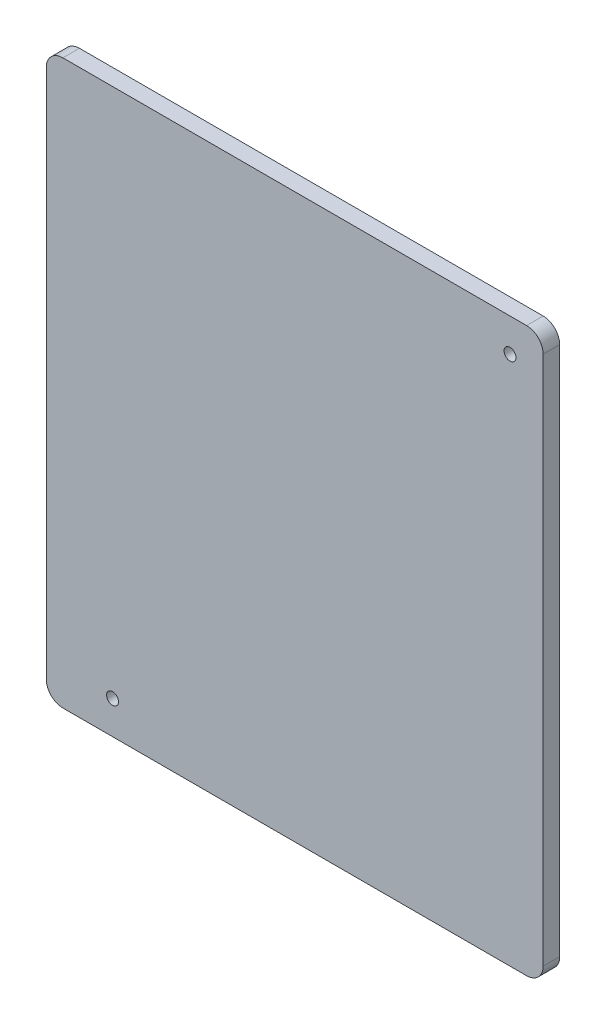
ISO-10303-21;
HEADER;
FILE_DESCRIPTION(('STEP AP214'),'2;1');
FILE_NAME('part.step','',(''),(''),'','','');
FILE_SCHEMA(('AUTOMOTIVE_DESIGN { 1 0 10303 214 1 1 1 1 }'));
ENDSEC;
DATA;
#1=APPLICATION_CONTEXT('core data for automotive mechanical design processes');
#2=APPLICATION_PROTOCOL_DEFINITION('international standard','automotive_design',2000,#1);
#3=PRODUCT_CONTEXT('',#1,'mechanical');
#4=PRODUCT('Part','Part','',(#3));
#5=PRODUCT_RELATED_PRODUCT_CATEGORY('part','',(#4));
#6=PRODUCT_DEFINITION_FORMATION('','',#4);
#7=PRODUCT_DEFINITION_CONTEXT('part definition',#1,'design');
#8=PRODUCT_DEFINITION('design','',#6,#7);
#9=PRODUCT_DEFINITION_SHAPE('','',#8);
#10=(LENGTH_UNIT() NAMED_UNIT(*) SI_UNIT(.MILLI.,.METRE.));
#11=(NAMED_UNIT(*) PLANE_ANGLE_UNIT() SI_UNIT($,.RADIAN.));
#12=(NAMED_UNIT(*) SI_UNIT($,.STERADIAN.) SOLID_ANGLE_UNIT());
#13=UNCERTAINTY_MEASURE_WITH_UNIT(LENGTH_MEASURE(1.E-05),#10,'distance_accuracy_value','');
#14=(GEOMETRIC_REPRESENTATION_CONTEXT(3) GLOBAL_UNCERTAINTY_ASSIGNED_CONTEXT((#13)) GLOBAL_UNIT_ASSIGNED_CONTEXT((#10,
#11,#12)) REPRESENTATION_CONTEXT('',''));
#15=CARTESIAN_POINT('',(0.,0.,0.));
#16=DIRECTION('',(0.,0.,1.));
#17=DIRECTION('',(1.,0.,0.));
#18=AXIS2_PLACEMENT_3D('',#15,#16,#17);
#19=CARTESIAN_POINT('',(140.,0.,5.));
#20=DIRECTION('',(0.,0.,-1.));
#21=DIRECTION('',(-1.,0.,0.));
#22=AXIS2_PLACEMENT_3D('',#19,#20,#21);
#23=CYLINDRICAL_SURFACE('',#22,5.);
#24=CARTESIAN_POINT('',(140.,0.,0.));
#25=DIRECTION('',(0.,0.,1.));
#26=DIRECTION('',(1.,0.,0.));
#27=AXIS2_PLACEMENT_3D('',#24,#25,#26);
#28=CIRCLE('',#27,5.);
#29=CARTESIAN_POINT('',(140.,-5.,0.));
#30=VERTEX_POINT('',#29);
#31=CARTESIAN_POINT('',(145.,0.,0.));
#32=VERTEX_POINT('',#31);
#33=EDGE_CURVE('E130',#30,#32,#28,.T.);
#34=ORIENTED_EDGE('',*,*,#33,.T.);
#35=DIRECTION('',(0.,0.,-1.));
#36=VECTOR('',#35,1.);
#37=CARTESIAN_POINT('',(145.,0.,5.));
#38=LINE('',#37,#36);
#39=CARTESIAN_POINT('',(145.,0.,5.));
#40=VERTEX_POINT('',#39);
#41=EDGE_CURVE('E11',#40,#32,#38,.T.);
#42=ORIENTED_EDGE('',*,*,#41,.F.);
#43=CARTESIAN_POINT('',(140.,0.,5.));
#44=DIRECTION('',(0.,0.,1.));
#45=DIRECTION('',(1.,0.,0.));
#46=AXIS2_PLACEMENT_3D('',#43,#44,#45);
#47=CIRCLE('',#46,5.);
#48=CARTESIAN_POINT('',(140.,-5.,5.));
#49=VERTEX_POINT('',#48);
#50=EDGE_CURVE('E144',#49,#40,#47,.T.);
#51=ORIENTED_EDGE('',*,*,#50,.F.);
#52=DIRECTION('',(0.,0.,-1.));
#53=VECTOR('',#52,1.);
#54=CARTESIAN_POINT('',(140.,-5.,5.));
#55=LINE('',#54,#53);
#56=EDGE_CURVE('E126',#49,#30,#55,.T.);
#57=ORIENTED_EDGE('',*,*,#56,.T.);
#58=EDGE_LOOP('',(#34,#42,#51,#57));
#59=FACE_BOUND('',#58,.T.);
#60=ADVANCED_FACE('F33',(#59),#23,.T.);
#61=CARTESIAN_POINT('',(145.,0.,5.));
#62=DIRECTION('',(-1.,0.,0.));
#63=DIRECTION('',(0.,0.,1.));
#64=AXIS2_PLACEMENT_3D('',#61,#62,#63);
#65=PLANE('',#64);
#66=DIRECTION('',(0.,1.,0.));
#67=VECTOR('',#66,1.);
#68=CARTESIAN_POINT('',(145.,0.,0.));
#69=LINE('',#68,#67);
#70=CARTESIAN_POINT('',(145.,160.,0.));
#71=VERTEX_POINT('',#70);
#72=EDGE_CURVE('E133',#32,#71,#69,.T.);
#73=ORIENTED_EDGE('',*,*,#72,.T.);
#74=DIRECTION('',(0.,0.,-1.));
#75=VECTOR('',#74,1.);
#76=CARTESIAN_POINT('',(145.,160.,5.));
#77=LINE('',#76,#75);
#78=CARTESIAN_POINT('',(145.,160.,5.));
#79=VERTEX_POINT('',#78);
#80=EDGE_CURVE('E42',#79,#71,#77,.T.);
#81=ORIENTED_EDGE('',*,*,#80,.F.);
#82=DIRECTION('',(0.,1.,0.));
#83=VECTOR('',#82,1.);
#84=CARTESIAN_POINT('',(145.,0.,5.));
#85=LINE('',#84,#83);
#86=EDGE_CURVE('E93',#40,#79,#85,.T.);
#87=ORIENTED_EDGE('',*,*,#86,.F.);
#88=ORIENTED_EDGE('',*,*,#41,.T.);
#89=EDGE_LOOP('',(#73,#81,#87,#88));
#90=FACE_BOUND('',#89,.T.);
#91=ADVANCED_FACE('F207',(#90),#65,.F.);
#92=CARTESIAN_POINT('',(140.,160.,5.));
#93=DIRECTION('',(0.,0.,-1.));
#94=DIRECTION('',(-1.,0.,0.));
#95=AXIS2_PLACEMENT_3D('',#92,#93,#94);
#96=CYLINDRICAL_SURFACE('',#95,5.);
#97=CARTESIAN_POINT('',(140.,160.,0.));
#98=DIRECTION('',(0.,0.,1.));
#99=DIRECTION('',(1.,0.,0.));
#100=AXIS2_PLACEMENT_3D('',#97,#98,#99);
#101=CIRCLE('',#100,5.);
#102=CARTESIAN_POINT('',(140.,165.,0.));
#103=VERTEX_POINT('',#102);
#104=EDGE_CURVE('E135',#71,#103,#101,.T.);
#105=ORIENTED_EDGE('',*,*,#104,.T.);
#106=DIRECTION('',(0.,0.,-1.));
#107=VECTOR('',#106,1.);
#108=CARTESIAN_POINT('',(140.,165.,5.));
#109=LINE('',#108,#107);
#110=CARTESIAN_POINT('',(140.,165.,5.));
#111=VERTEX_POINT('',#110);
#112=EDGE_CURVE('E151',#111,#103,#109,.T.);
#113=ORIENTED_EDGE('',*,*,#112,.F.);
#114=CARTESIAN_POINT('',(140.,160.,5.));
#115=DIRECTION('',(0.,0.,1.));
#116=DIRECTION('',(1.,0.,0.));
#117=AXIS2_PLACEMENT_3D('',#114,#115,#116);
#118=CIRCLE('',#117,5.);
#119=EDGE_CURVE('E160',#79,#111,#118,.T.);
#120=ORIENTED_EDGE('',*,*,#119,.F.);
#121=ORIENTED_EDGE('',*,*,#80,.T.);
#122=EDGE_LOOP('',(#105,#113,#120,#121));
#123=FACE_BOUND('',#122,.T.);
#124=ADVANCED_FACE('F158',(#123),#96,.T.);
#125=CARTESIAN_POINT('',(0.,165.,5.));
#126=DIRECTION('',(0.,-1.,0.));
#127=DIRECTION('',(0.,0.,-1.));
#128=AXIS2_PLACEMENT_3D('',#125,#126,#127);
#129=PLANE('',#128);
#130=DIRECTION('',(-1.,0.,0.));
#131=VECTOR('',#130,1.);
#132=CARTESIAN_POINT('',(0.,165.,0.));
#133=LINE('',#132,#131);
#134=CARTESIAN_POINT('',(0.,165.,0.));
#135=VERTEX_POINT('',#134);
#136=EDGE_CURVE('E137',#103,#135,#133,.T.);
#137=ORIENTED_EDGE('',*,*,#136,.T.);
#138=DIRECTION('',(0.,0.,-1.));
#139=VECTOR('',#138,1.);
#140=CARTESIAN_POINT('',(0.,165.,5.));
#141=LINE('',#140,#139);
#142=CARTESIAN_POINT('',(0.,165.,5.));
#143=VERTEX_POINT('',#142);
#144=EDGE_CURVE('E148',#143,#135,#141,.T.);
#145=ORIENTED_EDGE('',*,*,#144,.F.);
#146=DIRECTION('',(-1.,0.,0.));
#147=VECTOR('',#146,1.);
#148=CARTESIAN_POINT('',(0.,165.,5.));
#149=LINE('',#148,#147);
#150=EDGE_CURVE('E172',#111,#143,#149,.T.);
#151=ORIENTED_EDGE('',*,*,#150,.F.);
#152=ORIENTED_EDGE('',*,*,#112,.T.);
#153=EDGE_LOOP('',(#137,#145,#151,#152));
#154=FACE_BOUND('',#153,.T.);
#155=ADVANCED_FACE('F168',(#154),#129,.F.);
#156=CARTESIAN_POINT('',(0.,160.,5.));
#157=DIRECTION('',(0.,0.,-1.));
#158=DIRECTION('',(-1.,0.,0.));
#159=AXIS2_PLACEMENT_3D('',#156,#157,#158);
#160=CYLINDRICAL_SURFACE('',#159,5.);
#161=CARTESIAN_POINT('',(0.,160.,0.));
#162=DIRECTION('',(0.,0.,1.));
#163=DIRECTION('',(1.,0.,0.));
#164=AXIS2_PLACEMENT_3D('',#161,#162,#163);
#165=CIRCLE('',#164,5.);
#166=CARTESIAN_POINT('',(-5.,160.,0.));
#167=VERTEX_POINT('',#166);
#168=EDGE_CURVE('E139',#135,#167,#165,.T.);
#169=ORIENTED_EDGE('',*,*,#168,.T.);
#170=DIRECTION('',(0.,0.,-1.));
#171=VECTOR('',#170,1.);
#172=CARTESIAN_POINT('',(-5.,160.,5.));
#173=LINE('',#172,#171);
#174=CARTESIAN_POINT('',(-5.,160.,5.));
#175=VERTEX_POINT('',#174);
#176=EDGE_CURVE('E121',#175,#167,#173,.T.);
#177=ORIENTED_EDGE('',*,*,#176,.F.);
#178=CARTESIAN_POINT('',(0.,160.,5.));
#179=DIRECTION('',(0.,0.,1.));
#180=DIRECTION('',(1.,0.,0.));
#181=AXIS2_PLACEMENT_3D('',#178,#179,#180);
#182=CIRCLE('',#181,5.);
#183=EDGE_CURVE('E112',#143,#175,#182,.T.);
#184=ORIENTED_EDGE('',*,*,#183,.F.);
#185=ORIENTED_EDGE('',*,*,#144,.T.);
#186=EDGE_LOOP('',(#169,#177,#184,#185));
#187=FACE_BOUND('',#186,.T.);
#188=ADVANCED_FACE('F171',(#187),#160,.T.);
#189=CARTESIAN_POINT('',(-5.,0.,5.));
#190=DIRECTION('',(1.,0.,0.));
#191=DIRECTION('',(0.,0.,-1.));
#192=AXIS2_PLACEMENT_3D('',#189,#190,#191);
#193=PLANE('',#192);
#194=DIRECTION('',(0.,-1.,0.));
#195=VECTOR('',#194,1.);
#196=CARTESIAN_POINT('',(-5.,0.,0.));
#197=LINE('',#196,#195);
#198=CARTESIAN_POINT('',(-5.,0.,0.));
#199=VERTEX_POINT('',#198);
#200=EDGE_CURVE('E120',#167,#199,#197,.T.);
#201=ORIENTED_EDGE('',*,*,#200,.T.);
#202=DIRECTION('',(0.,0.,-1.));
#203=VECTOR('',#202,1.);
#204=CARTESIAN_POINT('',(-5.,0.,5.));
#205=LINE('',#204,#203);
#206=CARTESIAN_POINT('',(-5.,0.,5.));
#207=VERTEX_POINT('',#206);
#208=EDGE_CURVE('E117',#207,#199,#205,.T.);
#209=ORIENTED_EDGE('',*,*,#208,.F.);
#210=DIRECTION('',(0.,-1.,0.));
#211=VECTOR('',#210,1.);
#212=CARTESIAN_POINT('',(-5.,0.,5.));
#213=LINE('',#212,#211);
#214=EDGE_CURVE('E106',#175,#207,#213,.T.);
#215=ORIENTED_EDGE('',*,*,#214,.F.);
#216=ORIENTED_EDGE('',*,*,#176,.T.);
#217=EDGE_LOOP('',(#201,#209,#215,#216));
#218=FACE_BOUND('',#217,.T.);
#219=ADVANCED_FACE('F118',(#218),#193,.F.);
#220=CARTESIAN_POINT('',(0.,0.,5.));
#221=DIRECTION('',(0.,0.,-1.));
#222=DIRECTION('',(-1.,0.,0.));
#223=AXIS2_PLACEMENT_3D('',#220,#221,#222);
#224=CYLINDRICAL_SURFACE('',#223,5.);
#225=CARTESIAN_POINT('',(0.,0.,0.));
#226=DIRECTION('',(0.,0.,1.));
#227=DIRECTION('',(1.,0.,0.));
#228=AXIS2_PLACEMENT_3D('',#225,#226,#227);
#229=CIRCLE('',#228,5.);
#230=CARTESIAN_POINT('',(0.,-5.,0.));
#231=VERTEX_POINT('',#230);
#232=EDGE_CURVE('E79',#199,#231,#229,.T.);
#233=ORIENTED_EDGE('',*,*,#232,.T.);
#234=DIRECTION('',(0.,0.,-1.));
#235=VECTOR('',#234,1.);
#236=CARTESIAN_POINT('',(0.,-5.,5.));
#237=LINE('',#236,#235);
#238=CARTESIAN_POINT('',(0.,-5.,5.));
#239=VERTEX_POINT('',#238);
#240=EDGE_CURVE('E122',#239,#231,#237,.T.);
#241=ORIENTED_EDGE('',*,*,#240,.F.);
#242=CARTESIAN_POINT('',(0.,0.,5.));
#243=DIRECTION('',(0.,0.,1.));
#244=DIRECTION('',(1.,0.,0.));
#245=AXIS2_PLACEMENT_3D('',#242,#243,#244);
#246=CIRCLE('',#245,5.);
#247=EDGE_CURVE('E110',#207,#239,#246,.T.);
#248=ORIENTED_EDGE('',*,*,#247,.F.);
#249=ORIENTED_EDGE('',*,*,#208,.T.);
#250=EDGE_LOOP('',(#233,#241,#248,#249));
#251=FACE_BOUND('',#250,.T.);
#252=ADVANCED_FACE('F124',(#251),#224,.T.);
#253=CARTESIAN_POINT('',(0.,-5.,5.));
#254=DIRECTION('',(0.,1.,0.));
#255=DIRECTION('',(0.,0.,1.));
#256=AXIS2_PLACEMENT_3D('',#253,#254,#255);
#257=PLANE('',#256);
#258=DIRECTION('',(1.,0.,0.));
#259=VECTOR('',#258,1.);
#260=CARTESIAN_POINT('',(0.,-5.,0.));
#261=LINE('',#260,#259);
#262=EDGE_CURVE('E85',#231,#30,#261,.T.);
#263=ORIENTED_EDGE('',*,*,#262,.T.);
#264=ORIENTED_EDGE('',*,*,#56,.F.);
#265=DIRECTION('',(1.,0.,0.));
#266=VECTOR('',#265,1.);
#267=CARTESIAN_POINT('',(0.,-5.,5.));
#268=LINE('',#267,#266);
#269=EDGE_CURVE('E50',#239,#49,#268,.T.);
#270=ORIENTED_EDGE('',*,*,#269,.F.);
#271=ORIENTED_EDGE('',*,*,#240,.T.);
#272=EDGE_LOOP('',(#263,#264,#270,#271));
#273=FACE_BOUND('',#272,.T.);
#274=ADVANCED_FACE('F214',(#273),#257,.F.);
#275=CARTESIAN_POINT('',(140.,0.,5.));
#276=DIRECTION('',(0.,0.,1.));
#277=DIRECTION('',(1.,0.,0.));
#278=AXIS2_PLACEMENT_3D('',#275,#276,#277);
#279=PLANE('',#278);
#280=CARTESIAN_POINT('',(135.,155.,5.));
#281=DIRECTION('',(0.,0.,1.));
#282=DIRECTION('',(1.,0.,0.));
#283=AXIS2_PLACEMENT_3D('',#280,#281,#282);
#284=CIRCLE('',#283,1.8);
#285=CARTESIAN_POINT('',(136.8,155.,5.));
#286=VERTEX_POINT('',#285);
#287=EDGE_CURVE('E181',#286,#286,#284,.T.);
#288=ORIENTED_EDGE('',*,*,#287,.F.);
#289=EDGE_LOOP('',(#288));
#290=FACE_BOUND('',#289,.T.);
#291=CARTESIAN_POINT('',(15.,5.00000000000003,5.));
#292=DIRECTION('',(0.,0.,1.));
#293=DIRECTION('',(1.,0.,0.));
#294=AXIS2_PLACEMENT_3D('',#291,#292,#293);
#295=CIRCLE('',#294,1.8);
#296=CARTESIAN_POINT('',(16.8,5.00000000000003,5.));
#297=VERTEX_POINT('',#296);
#298=EDGE_CURVE('E36',#297,#297,#295,.T.);
#299=ORIENTED_EDGE('',*,*,#298,.F.);
#300=EDGE_LOOP('',(#299));
#301=FACE_BOUND('',#300,.T.);
#302=ORIENTED_EDGE('',*,*,#50,.T.);
#303=ORIENTED_EDGE('',*,*,#86,.T.);
#304=ORIENTED_EDGE('',*,*,#119,.T.);
#305=ORIENTED_EDGE('',*,*,#150,.T.);
#306=ORIENTED_EDGE('',*,*,#183,.T.);
#307=ORIENTED_EDGE('',*,*,#214,.T.);
#308=ORIENTED_EDGE('',*,*,#247,.T.);
#309=ORIENTED_EDGE('',*,*,#269,.T.);
#310=EDGE_LOOP('',(#302,#303,#304,#305,#306,#307,#308,#309));
#311=FACE_BOUND('',#310,.T.);
#312=ADVANCED_FACE('F108',(#290,#301,#311),#279,.T.);
#313=CARTESIAN_POINT('',(140.,0.,0.));
#314=DIRECTION('',(0.,0.,1.));
#315=DIRECTION('',(1.,0.,0.));
#316=AXIS2_PLACEMENT_3D('',#313,#314,#315);
#317=PLANE('',#316);
#318=CARTESIAN_POINT('',(135.,155.,0.));
#319=DIRECTION('',(0.,0.,-1.));
#320=DIRECTION('',(-1.,0.,0.));
#321=AXIS2_PLACEMENT_3D('',#318,#319,#320);
#322=CIRCLE('',#321,1.8);
#323=CARTESIAN_POINT('',(133.2,155.,0.));
#324=VERTEX_POINT('',#323);
#325=EDGE_CURVE('E184',#324,#324,#322,.T.);
#326=ORIENTED_EDGE('',*,*,#325,.F.);
#327=EDGE_LOOP('',(#326));
#328=FACE_BOUND('',#327,.T.);
#329=CARTESIAN_POINT('',(15.,5.00000000000003,0.));
#330=DIRECTION('',(0.,0.,-1.));
#331=DIRECTION('',(-1.,0.,0.));
#332=AXIS2_PLACEMENT_3D('',#329,#330,#331);
#333=CIRCLE('',#332,1.8);
#334=CARTESIAN_POINT('',(13.2,5.00000000000003,0.));
#335=VERTEX_POINT('',#334);
#336=EDGE_CURVE('E178',#335,#335,#333,.T.);
#337=ORIENTED_EDGE('',*,*,#336,.F.);
#338=EDGE_LOOP('',(#337));
#339=FACE_BOUND('',#338,.T.);
#340=ORIENTED_EDGE('',*,*,#33,.F.);
#341=ORIENTED_EDGE('',*,*,#262,.F.);
#342=ORIENTED_EDGE('',*,*,#232,.F.);
#343=ORIENTED_EDGE('',*,*,#200,.F.);
#344=ORIENTED_EDGE('',*,*,#168,.F.);
#345=ORIENTED_EDGE('',*,*,#136,.F.);
#346=ORIENTED_EDGE('',*,*,#104,.F.);
#347=ORIENTED_EDGE('',*,*,#72,.F.);
#348=EDGE_LOOP('',(#340,#341,#342,#343,#344,#345,#346,#347));
#349=FACE_BOUND('',#348,.T.);
#350=ADVANCED_FACE('F164',(#328,#339,#349),#317,.F.);
#351=CARTESIAN_POINT('',(15.,5.00000000000003,0.));
#352=DIRECTION('',(0.,0.,-1.));
#353=DIRECTION('',(-1.,0.,0.));
#354=AXIS2_PLACEMENT_3D('',#351,#352,#353);
#355=CYLINDRICAL_SURFACE('',#354,1.8);
#356=ORIENTED_EDGE('',*,*,#298,.T.);
#357=EDGE_LOOP('',(#356));
#358=FACE_BOUND('',#357,.T.);
#359=ORIENTED_EDGE('',*,*,#336,.T.);
#360=EDGE_LOOP('',(#359));
#361=FACE_BOUND('',#360,.T.);
#362=ADVANCED_FACE('F192',(#358,#361),#355,.F.);
#363=CARTESIAN_POINT('',(135.,155.,0.));
#364=DIRECTION('',(0.,0.,-1.));
#365=DIRECTION('',(-1.,0.,0.));
#366=AXIS2_PLACEMENT_3D('',#363,#364,#365);
#367=CYLINDRICAL_SURFACE('',#366,1.8);
#368=ORIENTED_EDGE('',*,*,#287,.T.);
#369=EDGE_LOOP('',(#368));
#370=FACE_BOUND('',#369,.T.);
#371=ORIENTED_EDGE('',*,*,#325,.T.);
#372=EDGE_LOOP('',(#371));
#373=FACE_BOUND('',#372,.T.);
#374=ADVANCED_FACE('F188',(#370,#373),#367,.F.);
#375=CLOSED_SHELL('',(#60,#91,#124,#155,#188,#219,#252,#274,#312,#350,#362,#374));
#376=MANIFOLD_SOLID_BREP('B2',#375);
#377=ADVANCED_BREP_SHAPE_REPRESENTATION('',(#18,#376),#14);
#378=SHAPE_DEFINITION_REPRESENTATION(#9,#377);
ENDSEC;
END-ISO-10303-21;
